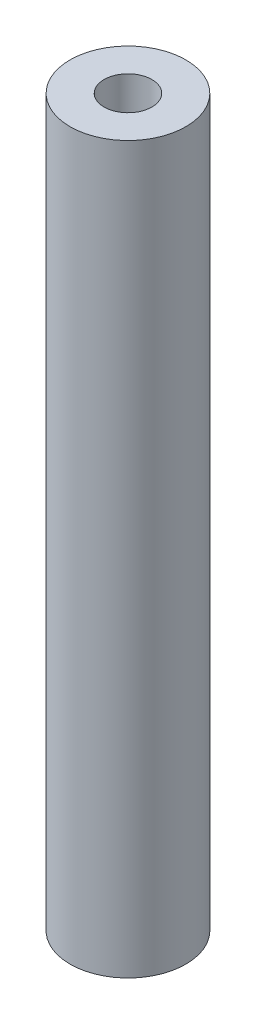
ISO-10303-21;
HEADER;
FILE_DESCRIPTION(('STEP AP214'),'2;1');
FILE_NAME('part.step','',(''),(''),'','','');
FILE_SCHEMA(('AUTOMOTIVE_DESIGN { 1 0 10303 214 1 1 1 1 }'));
ENDSEC;
DATA;
#1=APPLICATION_CONTEXT('core data for automotive mechanical design processes');
#2=APPLICATION_PROTOCOL_DEFINITION('international standard','automotive_design',2000,#1);
#3=PRODUCT_CONTEXT('',#1,'mechanical');
#4=PRODUCT('Part','Part','',(#3));
#5=PRODUCT_RELATED_PRODUCT_CATEGORY('part','',(#4));
#6=PRODUCT_DEFINITION_FORMATION('','',#4);
#7=PRODUCT_DEFINITION_CONTEXT('part definition',#1,'design');
#8=PRODUCT_DEFINITION('design','',#6,#7);
#9=PRODUCT_DEFINITION_SHAPE('','',#8);
#10=(LENGTH_UNIT() NAMED_UNIT(*) SI_UNIT(.MILLI.,.METRE.));
#11=(NAMED_UNIT(*) PLANE_ANGLE_UNIT() SI_UNIT($,.RADIAN.));
#12=(NAMED_UNIT(*) SI_UNIT($,.STERADIAN.) SOLID_ANGLE_UNIT());
#13=UNCERTAINTY_MEASURE_WITH_UNIT(LENGTH_MEASURE(1.E-05),#10,'distance_accuracy_value','');
#14=(GEOMETRIC_REPRESENTATION_CONTEXT(3) GLOBAL_UNCERTAINTY_ASSIGNED_CONTEXT((#13)) GLOBAL_UNIT_ASSIGNED_CONTEXT((#10,
#11,#12)) REPRESENTATION_CONTEXT('',''));
#15=CARTESIAN_POINT('',(0.,0.,0.));
#16=DIRECTION('',(0.,0.,1.));
#17=DIRECTION('',(1.,0.,0.));
#18=AXIS2_PLACEMENT_3D('',#15,#16,#17);
#19=CARTESIAN_POINT('',(0.,50.1,0.));
#20=DIRECTION('',(0.,-1.,0.));
#21=DIRECTION('',(0.,0.,-1.));
#22=AXIS2_PLACEMENT_3D('',#19,#20,#21);
#23=CYLINDRICAL_SURFACE('',#22,4.);
#24=CARTESIAN_POINT('',(0.,50.1,0.));
#25=DIRECTION('',(0.,1.,0.));
#26=DIRECTION('',(0.,0.,1.));
#27=AXIS2_PLACEMENT_3D('',#24,#25,#26);
#28=CIRCLE('',#27,4.);
#29=CARTESIAN_POINT('',(0.,50.1,4.));
#30=VERTEX_POINT('',#29);
#31=EDGE_CURVE('E10',#30,#30,#28,.T.);
#32=ORIENTED_EDGE('',*,*,#31,.F.);
#33=EDGE_LOOP('',(#32));
#34=FACE_BOUND('',#33,.T.);
#35=CARTESIAN_POINT('',(0.,0.,0.));
#36=DIRECTION('',(0.,1.,0.));
#37=DIRECTION('',(0.,0.,1.));
#38=AXIS2_PLACEMENT_3D('',#35,#36,#37);
#39=CIRCLE('',#38,4.);
#40=CARTESIAN_POINT('',(0.,0.,4.));
#41=VERTEX_POINT('',#40);
#42=EDGE_CURVE('E46',#41,#41,#39,.T.);
#43=ORIENTED_EDGE('',*,*,#42,.T.);
#44=EDGE_LOOP('',(#43));
#45=FACE_BOUND('',#44,.T.);
#46=ADVANCED_FACE('F43',(#34,#45),#23,.T.);
#47=CARTESIAN_POINT('',(0.,50.1,0.));
#48=DIRECTION('',(0.,1.,0.));
#49=DIRECTION('',(0.,0.,1.));
#50=AXIS2_PLACEMENT_3D('',#47,#48,#49);
#51=PLANE('',#50);
#52=CARTESIAN_POINT('',(0.,50.1,0.));
#53=DIRECTION('',(0.,1.,0.));
#54=DIRECTION('',(0.,0.,1.));
#55=AXIS2_PLACEMENT_3D('',#52,#53,#54);
#56=CIRCLE('',#55,1.65);
#57=CARTESIAN_POINT('',(0.,50.1,1.65));
#58=VERTEX_POINT('',#57);
#59=EDGE_CURVE('E55',#58,#58,#56,.T.);
#60=ORIENTED_EDGE('',*,*,#59,.F.);
#61=EDGE_LOOP('',(#60));
#62=FACE_BOUND('',#61,.T.);
#63=ORIENTED_EDGE('',*,*,#31,.T.);
#64=EDGE_LOOP('',(#63));
#65=FACE_BOUND('',#64,.T.);
#66=ADVANCED_FACE('F80',(#62,#65),#51,.T.);
#67=CARTESIAN_POINT('',(0.,0.,0.));
#68=DIRECTION('',(0.,1.,0.));
#69=DIRECTION('',(0.,0.,1.));
#70=AXIS2_PLACEMENT_3D('',#67,#68,#69);
#71=PLANE('',#70);
#72=CARTESIAN_POINT('',(0.,0.,0.));
#73=DIRECTION('',(0.,-1.,0.));
#74=DIRECTION('',(0.,0.,-1.));
#75=AXIS2_PLACEMENT_3D('',#72,#73,#74);
#76=CIRCLE('',#75,1.65);
#77=CARTESIAN_POINT('',(0.,0.,-1.65));
#78=VERTEX_POINT('',#77);
#79=EDGE_CURVE('E61',#78,#78,#76,.T.);
#80=ORIENTED_EDGE('',*,*,#79,.F.);
#81=EDGE_LOOP('',(#80));
#82=FACE_BOUND('',#81,.T.);
#83=ORIENTED_EDGE('',*,*,#42,.F.);
#84=EDGE_LOOP('',(#83));
#85=FACE_BOUND('',#84,.T.);
#86=ADVANCED_FACE('F76',(#82,#85),#71,.F.);
#87=CARTESIAN_POINT('',(0.,42.1,0.));
#88=DIRECTION('',(0.,1.,0.));
#89=DIRECTION('',(0.,0.,1.));
#90=AXIS2_PLACEMENT_3D('',#87,#88,#89);
#91=CYLINDRICAL_SURFACE('',#90,1.65);
#92=CARTESIAN_POINT('',(0.,42.1,0.));
#93=DIRECTION('',(0.,1.,0.));
#94=DIRECTION('',(0.,0.,1.));
#95=AXIS2_PLACEMENT_3D('',#92,#93,#94);
#96=CIRCLE('',#95,1.65);
#97=CARTESIAN_POINT('',(0.,42.1,1.65));
#98=VERTEX_POINT('',#97);
#99=EDGE_CURVE('E53',#98,#98,#96,.T.);
#100=ORIENTED_EDGE('',*,*,#99,.F.);
#101=EDGE_LOOP('',(#100));
#102=FACE_BOUND('',#101,.T.);
#103=ORIENTED_EDGE('',*,*,#59,.T.);
#104=EDGE_LOOP('',(#103));
#105=FACE_BOUND('',#104,.T.);
#106=ADVANCED_FACE('F79',(#102,#105),#91,.F.);
#107=CARTESIAN_POINT('',(0.,42.1,0.));
#108=DIRECTION('',(0.,1.,0.));
#109=DIRECTION('',(0.,0.,1.));
#110=AXIS2_PLACEMENT_3D('',#107,#108,#109);
#111=PLANE('',#110);
#112=ORIENTED_EDGE('',*,*,#99,.T.);
#113=EDGE_LOOP('',(#112));
#114=FACE_BOUND('',#113,.T.);
#115=ADVANCED_FACE('F72',(#114),#111,.T.);
#116=CARTESIAN_POINT('',(0.,8.,0.));
#117=DIRECTION('',(0.,-1.,0.));
#118=DIRECTION('',(0.,0.,-1.));
#119=AXIS2_PLACEMENT_3D('',#116,#117,#118);
#120=CYLINDRICAL_SURFACE('',#119,1.65);
#121=CARTESIAN_POINT('',(0.,8.,0.));
#122=DIRECTION('',(0.,-1.,0.));
#123=DIRECTION('',(0.,0.,-1.));
#124=AXIS2_PLACEMENT_3D('',#121,#122,#123);
#125=CIRCLE('',#124,1.65);
#126=CARTESIAN_POINT('',(0.,8.,-1.65));
#127=VERTEX_POINT('',#126);
#128=EDGE_CURVE('E58',#127,#127,#125,.T.);
#129=ORIENTED_EDGE('',*,*,#128,.F.);
#130=EDGE_LOOP('',(#129));
#131=FACE_BOUND('',#130,.T.);
#132=ORIENTED_EDGE('',*,*,#79,.T.);
#133=EDGE_LOOP('',(#132));
#134=FACE_BOUND('',#133,.T.);
#135=ADVANCED_FACE('F69',(#131,#134),#120,.F.);
#136=CARTESIAN_POINT('',(0.,8.,0.));
#137=DIRECTION('',(0.,-1.,0.));
#138=DIRECTION('',(0.,0.,-1.));
#139=AXIS2_PLACEMENT_3D('',#136,#137,#138);
#140=PLANE('',#139);
#141=ORIENTED_EDGE('',*,*,#128,.T.);
#142=EDGE_LOOP('',(#141));
#143=FACE_BOUND('',#142,.T.);
#144=ADVANCED_FACE('F67',(#143),#140,.T.);
#145=CLOSED_SHELL('',(#46,#66,#86,#106,#115,#135,#144));
#146=MANIFOLD_SOLID_BREP('B2',#145);
#147=ADVANCED_BREP_SHAPE_REPRESENTATION('',(#18,#146),#14);
#148=SHAPE_DEFINITION_REPRESENTATION(#9,#147);
ENDSEC;
END-ISO-10303-21;
